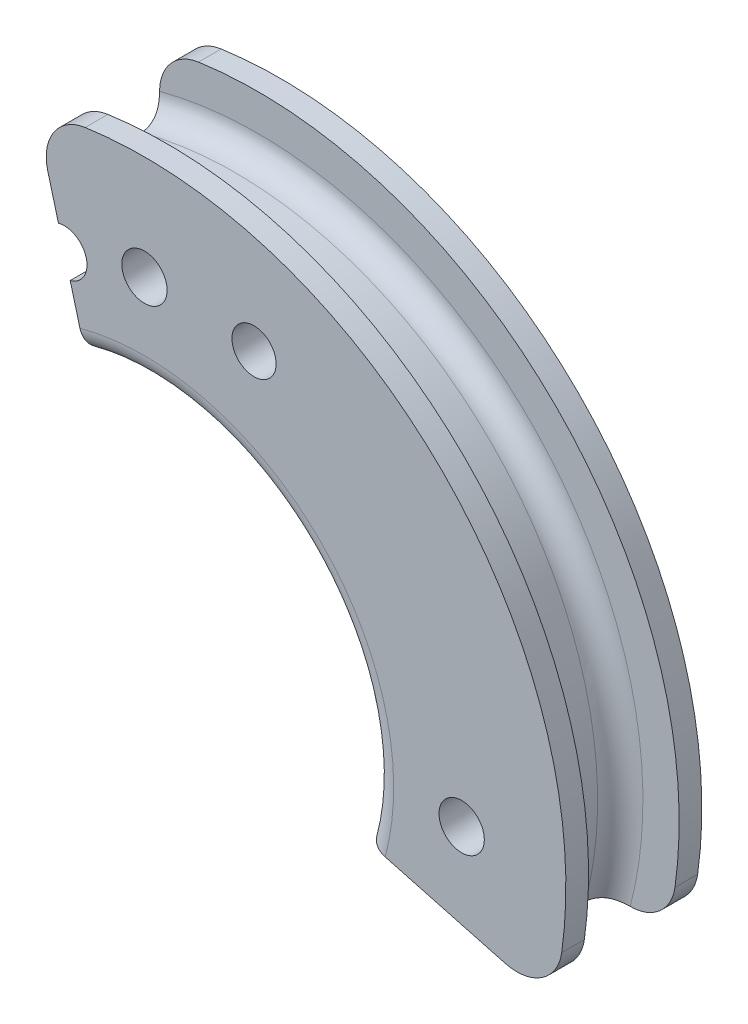
ISO-10303-21;
HEADER;
FILE_DESCRIPTION(('STEP AP214'),'2;1');
FILE_NAME('part.step','',(''),(''),'','','');
FILE_SCHEMA(('AUTOMOTIVE_DESIGN { 1 0 10303 214 1 1 1 1 }'));
ENDSEC;
DATA;
#1=APPLICATION_CONTEXT('core data for automotive mechanical design processes');
#2=APPLICATION_PROTOCOL_DEFINITION('international standard','automotive_design',2000,#1);
#3=PRODUCT_CONTEXT('',#1,'mechanical');
#4=PRODUCT('Part','Part','',(#3));
#5=PRODUCT_RELATED_PRODUCT_CATEGORY('part','',(#4));
#6=PRODUCT_DEFINITION_FORMATION('','',#4);
#7=PRODUCT_DEFINITION_CONTEXT('part definition',#1,'design');
#8=PRODUCT_DEFINITION('design','',#6,#7);
#9=PRODUCT_DEFINITION_SHAPE('','',#8);
#10=(LENGTH_UNIT() NAMED_UNIT(*) SI_UNIT(.MILLI.,.METRE.));
#11=(NAMED_UNIT(*) PLANE_ANGLE_UNIT() SI_UNIT($,.RADIAN.));
#12=(NAMED_UNIT(*) SI_UNIT($,.STERADIAN.) SOLID_ANGLE_UNIT());
#13=UNCERTAINTY_MEASURE_WITH_UNIT(LENGTH_MEASURE(1.E-05),#10,'distance_accuracy_value','');
#14=(GEOMETRIC_REPRESENTATION_CONTEXT(3) GLOBAL_UNCERTAINTY_ASSIGNED_CONTEXT((#13)) GLOBAL_UNIT_ASSIGNED_CONTEXT((#10,
#11,#12)) REPRESENTATION_CONTEXT('',''));
#15=CARTESIAN_POINT('',(0.,0.,0.));
#16=DIRECTION('',(0.,0.,1.));
#17=DIRECTION('',(1.,0.,0.));
#18=AXIS2_PLACEMENT_3D('',#15,#16,#17);
#19=CARTESIAN_POINT('',(-2.65426315247376,9.90584494169013,-1.5));
#20=DIRECTION('',(0.965925826289069,0.258819045102518,0.));
#21=DIRECTION('',(-0.258819045102518,0.965925826289069,0.));
#22=AXIS2_PLACEMENT_3D('',#19,#20,#21);
#23=PLANE('',#22);
#24=CARTESIAN_POINT('',(-2.1999618833714,8.21036952345709,-0.499999999999999));
#25=DIRECTION('',(0.965925826289069,0.258819045102518,0.));
#26=DIRECTION('',(-0.258819045102518,0.965925826289069,0.));
#27=AXIS2_PLACEMENT_3D('',#24,#25,#26);
#28=CIRCLE('',#27,0.500000000000001);
#29=CARTESIAN_POINT('',(-2.07055236082014,7.72740661031255,-0.499999999999999));
#30=VERTEX_POINT('',#29);
#31=CARTESIAN_POINT('',(-2.13254957000702,7.95878334492546,-0.926802032303871));
#32=VERTEX_POINT('',#31);
#33=EDGE_CURVE('E198',#30,#32,#28,.T.);
#34=ORIENTED_EDGE('',*,*,#33,.T.);
#35=DIRECTION('',(0.,0.,-1.));
#36=VECTOR('',#35,1.);
#37=CARTESIAN_POINT('',(-2.13254957000702,7.95878334492546,-1.5));
#38=LINE('',#37,#36);
#39=CARTESIAN_POINT('',(-2.13254957000702,7.95878334492546,-1.5));
#40=VERTEX_POINT('',#39);
#41=EDGE_CURVE('E187',#32,#40,#38,.T.);
#42=ORIENTED_EDGE('',*,*,#41,.T.);
#43=DIRECTION('',(-0.258819045102518,0.965925826289069,0.));
#44=VECTOR('',#43,1.);
#45=CARTESIAN_POINT('',(-2.65426315247376,9.90584494169013,-1.5));
#46=LINE('',#45,#44);
#47=CARTESIAN_POINT('',(-1.89766269349181,7.08217358773951,-1.5));
#48=VERTEX_POINT('',#47);
#49=EDGE_CURVE('E180',#48,#40,#46,.T.);
#50=ORIENTED_EDGE('',*,*,#49,.F.);
#51=DIRECTION('',(0.,0.,1.));
#52=VECTOR('',#51,1.);
#53=CARTESIAN_POINT('',(-1.89766269349181,7.08217358773951,-1.5));
#54=LINE('',#53,#52);
#55=CARTESIAN_POINT('',(-1.89766269349181,7.08217358773951,1.5));
#56=VERTEX_POINT('',#55);
#57=EDGE_CURVE('E160',#48,#56,#54,.T.);
#58=ORIENTED_EDGE('',*,*,#57,.T.);
#59=DIRECTION('',(-0.258819045102518,0.965925826289069,0.));
#60=VECTOR('',#59,1.);
#61=CARTESIAN_POINT('',(-2.65426315247376,9.90584494169013,1.5));
#62=LINE('',#61,#60);
#63=CARTESIAN_POINT('',(-2.13254957000702,7.95878334492546,1.5));
#64=VERTEX_POINT('',#63);
#65=EDGE_CURVE('E377',#56,#64,#62,.T.);
#66=ORIENTED_EDGE('',*,*,#65,.T.);
#67=DIRECTION('',(0.,0.,-1.));
#68=VECTOR('',#67,1.);
#69=CARTESIAN_POINT('',(-2.13254957000702,7.95878334492546,1.));
#70=LINE('',#69,#68);
#71=CARTESIAN_POINT('',(-2.13254957000702,7.95878334492546,0.926802032303871));
#72=VERTEX_POINT('',#71);
#73=EDGE_CURVE('E442',#64,#72,#70,.T.);
#74=ORIENTED_EDGE('',*,*,#73,.T.);
#75=CARTESIAN_POINT('',(-2.1999618833714,8.21036952345709,0.5));
#76=DIRECTION('',(0.965925826289069,0.258819045102518,0.));
#77=DIRECTION('',(-0.258819045102518,0.965925826289069,0.));
#78=AXIS2_PLACEMENT_3D('',#75,#76,#77);
#79=CIRCLE('',#78,0.5);
#80=CARTESIAN_POINT('',(-2.07055236082014,7.72740661031255,0.499999999999999));
#81=VERTEX_POINT('',#80);
#82=EDGE_CURVE('E190',#72,#81,#79,.T.);
#83=ORIENTED_EDGE('',*,*,#82,.T.);
#84=DIRECTION('',(0.,0.,1.));
#85=VECTOR('',#84,1.);
#86=CARTESIAN_POINT('',(-2.07055236082014,7.72740661031255,0.));
#87=LINE('',#86,#85);
#88=EDGE_CURVE('E196',#81,#30,#87,.F.);
#89=ORIENTED_EDGE('',*,*,#88,.T.);
#90=EDGE_LOOP('',(#34,#42,#50,#58,#66,#74,#83,#89));
#91=FACE_BOUND('',#90,.T.);
#92=ADVANCED_FACE('F32',(#91),#23,.F.);
#93=CARTESIAN_POINT('',(0.,0.,1.5));
#94=DIRECTION('',(0.,0.,1.));
#95=DIRECTION('',(1.,0.,0.));
#96=AXIS2_PLACEMENT_3D('',#93,#94,#95);
#97=PLANE('',#96);
#98=DIRECTION('',(-0.965925826289066,0.258819045102528,0.));
#99=VECTOR('',#98,1.);
#100=CARTESIAN_POINT('',(10.3501453744562,-2.77331309463034,1.5));
#101=LINE('',#100,#99);
#102=CARTESIAN_POINT('',(7.95878334492544,-2.1325495700071,1.5));
#103=VERTEX_POINT('',#102);
#104=CARTESIAN_POINT('',(5.31259204458986,-1.4235047480639,1.5));
#105=VERTEX_POINT('',#104);
#106=EDGE_CURVE('E376',#103,#105,#101,.T.);
#107=ORIENTED_EDGE('',*,*,#106,.F.);
#108=CARTESIAN_POINT('',(8.21760239002796,-1.16662374371804,1.5));
#109=DIRECTION('',(0.,0.,1.));
#110=DIRECTION('',(1.,0.,0.));
#111=AXIS2_PLACEMENT_3D('',#108,#109,#110);
#112=CIRCLE('',#111,1.);
#113=CARTESIAN_POINT('',(9.20767496713977,-1.30718082127443,1.5));
#114=VERTEX_POINT('',#113);
#115=EDGE_CURVE('E424',#103,#114,#112,.T.);
#116=ORIENTED_EDGE('',*,*,#115,.T.);
#117=CARTESIAN_POINT('',(0.,0.,1.5));
#118=DIRECTION('',(0.,0.,1.));
#119=DIRECTION('',(1.,0.,0.));
#120=AXIS2_PLACEMENT_3D('',#117,#118,#119);
#121=CIRCLE('',#120,9.3);
#122=CARTESIAN_POINT('',(-1.30718082127433,9.20767496713978,1.5));
#123=VERTEX_POINT('',#122);
#124=EDGE_CURVE('E216',#114,#123,#121,.T.);
#125=ORIENTED_EDGE('',*,*,#124,.T.);
#126=CARTESIAN_POINT('',(-1.16662374371795,8.21760239002798,1.5));
#127=DIRECTION('',(0.,0.,1.));
#128=DIRECTION('',(1.,0.,0.));
#129=AXIS2_PLACEMENT_3D('',#126,#127,#128);
#130=CIRCLE('',#129,1.);
#131=EDGE_CURVE('E421',#123,#64,#130,.T.);
#132=ORIENTED_EDGE('',*,*,#131,.T.);
#133=ORIENTED_EDGE('',*,*,#65,.F.);
#134=CARTESIAN_POINT('',(-1.76825317094055,6.59921067459497,1.5));
#135=DIRECTION('',(0.,0.,1.));
#136=DIRECTION('',(1.,0.,0.));
#137=AXIS2_PLACEMENT_3D('',#134,#135,#136);
#138=CIRCLE('',#137,0.500000000000001);
#139=CARTESIAN_POINT('',(-1.63884364838929,6.11624776145044,1.5));
#140=VERTEX_POINT('',#139);
#141=EDGE_CURVE('E167',#140,#56,#138,.T.);
#142=ORIENTED_EDGE('',*,*,#141,.F.);
#143=CARTESIAN_POINT('',(-1.42350474806385,5.31259204458988,1.5));
#144=VERTEX_POINT('',#143);
#145=EDGE_CURVE('E191',#144,#140,#62,.T.);
#146=ORIENTED_EDGE('',*,*,#145,.F.);
#147=CARTESIAN_POINT('',(0.,0.,1.5));
#148=DIRECTION('',(0.,0.,1.));
#149=DIRECTION('',(1.,0.,0.));
#150=AXIS2_PLACEMENT_3D('',#147,#148,#149);
#151=CIRCLE('',#150,5.5);
#152=EDGE_CURVE('E255',#144,#105,#151,.F.);
#153=ORIENTED_EDGE('',*,*,#152,.T.);
#154=EDGE_LOOP('',(#107,#116,#125,#132,#133,#142,#146,#153));
#155=FACE_BOUND('',#154,.T.);
#156=CARTESIAN_POINT('',(2.41801105724694,6.7945993770836,1.5));
#157=DIRECTION('',(0.,0.,1.));
#158=DIRECTION('',(1.,0.,0.));
#159=AXIS2_PLACEMENT_3D('',#156,#157,#158);
#160=CIRCLE('',#159,0.487297939704498);
#161=CARTESIAN_POINT('',(2.90530899695144,6.7945993770836,1.5));
#162=VERTEX_POINT('',#161);
#163=EDGE_CURVE('E380',#162,#162,#160,.T.);
#164=ORIENTED_EDGE('',*,*,#163,.F.);
#165=EDGE_LOOP('',(#164));
#166=FACE_BOUND('',#165,.T.);
#167=CARTESIAN_POINT('',(7.,0.,1.5));
#168=DIRECTION('',(0.,0.,1.));
#169=DIRECTION('',(1.,0.,0.));
#170=AXIS2_PLACEMENT_3D('',#167,#168,#169);
#171=CIRCLE('',#170,0.499999999999999);
#172=CARTESIAN_POINT('',(7.5,0.,1.5));
#173=VERTEX_POINT('',#172);
#174=EDGE_CURVE('E241',#173,#173,#171,.T.);
#175=ORIENTED_EDGE('',*,*,#174,.F.);
#176=EDGE_LOOP('',(#175));
#177=FACE_BOUND('',#176,.T.);
#178=CARTESIAN_POINT('',(0.,7.,1.5));
#179=DIRECTION('',(0.,0.,1.));
#180=DIRECTION('',(1.,0.,0.));
#181=AXIS2_PLACEMENT_3D('',#178,#179,#180);
#182=CIRCLE('',#181,0.500000000000001);
#183=CARTESIAN_POINT('',(0.500000000000002,7.,1.5));
#184=VERTEX_POINT('',#183);
#185=EDGE_CURVE('E238',#184,#184,#182,.T.);
#186=ORIENTED_EDGE('',*,*,#185,.F.);
#187=EDGE_LOOP('',(#186));
#188=FACE_BOUND('',#187,.T.);
#189=ADVANCED_FACE('F333',(#155,#166,#177,#188),#97,.T.);
#190=CARTESIAN_POINT('',(0.,0.,-1.5));
#191=DIRECTION('',(0.,0.,1.));
#192=DIRECTION('',(1.,0.,0.));
#193=AXIS2_PLACEMENT_3D('',#190,#191,#192);
#194=PLANE('',#193);
#195=CARTESIAN_POINT('',(2.41801105724694,6.7945993770836,-1.5));
#196=DIRECTION('',(0.,0.,1.));
#197=DIRECTION('',(1.,0.,0.));
#198=AXIS2_PLACEMENT_3D('',#195,#196,#197);
#199=CIRCLE('',#198,1.4872979397045);
#200=CARTESIAN_POINT('',(0.930713117542441,6.7945993770836,-1.5));
#201=VERTEX_POINT('',#200);
#202=EDGE_CURVE('E443',#201,#201,#199,.T.);
#203=ORIENTED_EDGE('',*,*,#202,.T.);
#204=EDGE_LOOP('',(#203));
#205=FACE_BOUND('',#204,.T.);
#206=CARTESIAN_POINT('',(0.,0.,-1.5));
#207=DIRECTION('',(0.,0.,1.));
#208=DIRECTION('',(1.,0.,0.));
#209=AXIS2_PLACEMENT_3D('',#206,#207,#208);
#210=CIRCLE('',#209,5.5);
#211=CARTESIAN_POINT('',(5.31259204458986,-1.4235047480639,-1.5));
#212=VERTEX_POINT('',#211);
#213=CARTESIAN_POINT('',(5.5,0.,-1.5));
#214=VERTEX_POINT('',#213);
#215=EDGE_CURVE('E264',#212,#214,#210,.T.);
#216=ORIENTED_EDGE('',*,*,#215,.T.);
#217=CARTESIAN_POINT('',(7.,0.,-1.5));
#218=DIRECTION('',(0.,0.,1.));
#219=DIRECTION('',(1.,0.,0.));
#220=AXIS2_PLACEMENT_3D('',#217,#218,#219);
#221=CIRCLE('',#220,1.5);
#222=EDGE_CURVE('E45',#214,#214,#221,.T.);
#223=ORIENTED_EDGE('',*,*,#222,.T.);
#224=CARTESIAN_POINT('',(-1.42350474806385,5.31259204458988,-1.5));
#225=VERTEX_POINT('',#224);
#226=EDGE_CURVE('E263',#214,#225,#210,.T.);
#227=ORIENTED_EDGE('',*,*,#226,.T.);
#228=CARTESIAN_POINT('',(-1.63884364838929,6.11624776145044,-1.5));
#229=VERTEX_POINT('',#228);
#230=EDGE_CURVE('E182',#225,#229,#46,.T.);
#231=ORIENTED_EDGE('',*,*,#230,.T.);
#232=CARTESIAN_POINT('',(-1.76825317094055,6.59921067459497,-1.5));
#233=DIRECTION('',(0.,0.,1.));
#234=DIRECTION('',(1.,0.,0.));
#235=AXIS2_PLACEMENT_3D('',#232,#233,#234);
#236=CIRCLE('',#235,0.500000000000001);
#237=EDGE_CURVE('E164',#229,#48,#236,.T.);
#238=ORIENTED_EDGE('',*,*,#237,.T.);
#239=ORIENTED_EDGE('',*,*,#49,.T.);
#240=CARTESIAN_POINT('',(-1.16662374371795,8.21760239002798,-1.5));
#241=DIRECTION('',(0.,0.,1.));
#242=DIRECTION('',(1.,0.,0.));
#243=AXIS2_PLACEMENT_3D('',#240,#241,#242);
#244=CIRCLE('',#243,1.);
#245=CARTESIAN_POINT('',(-1.30718082127433,9.20767496713978,-1.5));
#246=VERTEX_POINT('',#245);
#247=EDGE_CURVE('E422',#40,#246,#244,.F.);
#248=ORIENTED_EDGE('',*,*,#247,.T.);
#249=CARTESIAN_POINT('',(0.,0.,-1.5));
#250=DIRECTION('',(0.,0.,1.));
#251=DIRECTION('',(1.,0.,0.));
#252=AXIS2_PLACEMENT_3D('',#249,#250,#251);
#253=CIRCLE('',#252,9.3);
#254=CARTESIAN_POINT('',(9.20767496713977,-1.30718082127443,-1.5));
#255=VERTEX_POINT('',#254);
#256=EDGE_CURVE('E219',#255,#246,#253,.T.);
#257=ORIENTED_EDGE('',*,*,#256,.F.);
#258=CARTESIAN_POINT('',(8.21760239002796,-1.16662374371804,-1.5));
#259=DIRECTION('',(0.,0.,1.));
#260=DIRECTION('',(1.,0.,0.));
#261=AXIS2_PLACEMENT_3D('',#258,#259,#260);
#262=CIRCLE('',#261,1.);
#263=CARTESIAN_POINT('',(7.95878334492544,-2.1325495700071,-1.5));
#264=VERTEX_POINT('',#263);
#265=EDGE_CURVE('E417',#255,#264,#262,.F.);
#266=ORIENTED_EDGE('',*,*,#265,.T.);
#267=DIRECTION('',(-0.965925826289066,0.258819045102528,0.));
#268=VECTOR('',#267,1.);
#269=CARTESIAN_POINT('',(10.3501453744562,-2.77331309463034,-1.5));
#270=LINE('',#269,#268);
#271=EDGE_CURVE('E188',#264,#212,#270,.T.);
#272=ORIENTED_EDGE('',*,*,#271,.T.);
#273=EDGE_LOOP('',(#216,#223,#227,#231,#238,#239,#248,#257,#266,#272));
#274=FACE_BOUND('',#273,.T.);
#275=CARTESIAN_POINT('',(0.,7.,-1.5));
#276=DIRECTION('',(0.,0.,1.));
#277=DIRECTION('',(1.,0.,0.));
#278=AXIS2_PLACEMENT_3D('',#275,#276,#277);
#279=CIRCLE('',#278,0.500000000000001);
#280=CARTESIAN_POINT('',(0.500000000000002,7.,-1.5));
#281=VERTEX_POINT('',#280);
#282=EDGE_CURVE('E237',#281,#281,#279,.T.);
#283=ORIENTED_EDGE('',*,*,#282,.T.);
#284=EDGE_LOOP('',(#283));
#285=FACE_BOUND('',#284,.T.);
#286=ADVANCED_FACE('F178',(#205,#274,#285),#194,.F.);
#287=CARTESIAN_POINT('',(0.,0.,1.5));
#288=DIRECTION('',(0.,0.,-1.));
#289=DIRECTION('',(-1.,0.,0.));
#290=AXIS2_PLACEMENT_3D('',#287,#288,#289);
#291=CYLINDRICAL_SURFACE('',#290,5.);
#292=DIRECTION('',(0.,0.,-1.));
#293=VECTOR('',#292,1.);
#294=CARTESIAN_POINT('',(4.82962913144533,-1.29409522551264,1.5));
#295=LINE('',#294,#293);
#296=CARTESIAN_POINT('',(4.82962913144533,-1.29409522551264,1.));
#297=VERTEX_POINT('',#296);
#298=CARTESIAN_POINT('',(4.82962913144533,-1.29409522551264,-1.));
#299=VERTEX_POINT('',#298);
#300=EDGE_CURVE('E210',#297,#299,#295,.T.);
#301=ORIENTED_EDGE('',*,*,#300,.F.);
#302=CARTESIAN_POINT('',(0.,0.,1.));
#303=DIRECTION('',(0.,0.,1.));
#304=DIRECTION('',(1.,0.,0.));
#305=AXIS2_PLACEMENT_3D('',#302,#303,#304);
#306=CIRCLE('',#305,5.);
#307=CARTESIAN_POINT('',(-1.29409522551259,4.82962913144534,1.));
#308=VERTEX_POINT('',#307);
#309=EDGE_CURVE('E248',#297,#308,#306,.T.);
#310=ORIENTED_EDGE('',*,*,#309,.T.);
#311=DIRECTION('',(0.,0.,-1.));
#312=VECTOR('',#311,1.);
#313=CARTESIAN_POINT('',(-1.29409522551259,4.82962913144534,1.5));
#314=LINE('',#313,#312);
#315=CARTESIAN_POINT('',(-1.29409522551259,4.82962913144534,-1.));
#316=VERTEX_POINT('',#315);
#317=EDGE_CURVE('E200',#316,#308,#314,.F.);
#318=ORIENTED_EDGE('',*,*,#317,.F.);
#319=CARTESIAN_POINT('',(0.,0.,-1.));
#320=DIRECTION('',(0.,0.,1.));
#321=DIRECTION('',(1.,0.,0.));
#322=AXIS2_PLACEMENT_3D('',#319,#320,#321);
#323=CIRCLE('',#322,5.);
#324=EDGE_CURVE('E172',#316,#299,#323,.F.);
#325=ORIENTED_EDGE('',*,*,#324,.T.);
#326=EDGE_LOOP('',(#301,#310,#318,#325));
#327=FACE_BOUND('',#326,.T.);
#328=ADVANCED_FACE('F361',(#327),#291,.F.);
#329=CARTESIAN_POINT('',(7.,0.,1.5));
#330=DIRECTION('',(0.,0.,-1.));
#331=DIRECTION('',(-1.,0.,0.));
#332=AXIS2_PLACEMENT_3D('',#329,#330,#331);
#333=CYLINDRICAL_SURFACE('',#332,0.499999999999999);
#334=CARTESIAN_POINT('',(7.,0.,-0.499999999999996));
#335=DIRECTION('',(0.,0.,1.));
#336=DIRECTION('',(1.,0.,0.));
#337=AXIS2_PLACEMENT_3D('',#334,#335,#336);
#338=CIRCLE('',#337,0.499999999999999);
#339=CARTESIAN_POINT('',(7.5,0.,-0.499999999999996));
#340=VERTEX_POINT('',#339);
#341=EDGE_CURVE('E40',#340,#340,#338,.F.);
#342=ORIENTED_EDGE('',*,*,#341,.T.);
#343=EDGE_LOOP('',(#342));
#344=FACE_BOUND('',#343,.T.);
#345=ORIENTED_EDGE('',*,*,#174,.T.);
#346=EDGE_LOOP('',(#345));
#347=FACE_BOUND('',#346,.T.);
#348=ADVANCED_FACE('F393',(#344,#347),#333,.F.);
#349=CARTESIAN_POINT('',(0.,7.,1.5));
#350=DIRECTION('',(0.,0.,-1.));
#351=DIRECTION('',(-1.,0.,0.));
#352=AXIS2_PLACEMENT_3D('',#349,#350,#351);
#353=CYLINDRICAL_SURFACE('',#352,0.500000000000001);
#354=ORIENTED_EDGE('',*,*,#185,.T.);
#355=EDGE_LOOP('',(#354));
#356=FACE_BOUND('',#355,.T.);
#357=ORIENTED_EDGE('',*,*,#282,.F.);
#358=EDGE_LOOP('',(#357));
#359=FACE_BOUND('',#358,.T.);
#360=ADVANCED_FACE('F329',(#356,#359),#353,.F.);
#361=CARTESIAN_POINT('',(0.,0.,-0.499999999999999));
#362=DIRECTION('',(0.,0.,1.));
#363=DIRECTION('',(1.,0.,0.));
#364=AXIS2_PLACEMENT_3D('',#361,#362,#363);
#365=TOROIDAL_SURFACE('',#364,8.5,0.500000000000001);
#366=CARTESIAN_POINT('',(8.21036952345707,-2.19996188337149,-0.499999999999999));
#367=DIRECTION('',(0.258819045102528,0.965925826289066,0.));
#368=DIRECTION('',(-0.965925826289067,0.258819045102528,0.));
#369=AXIS2_PLACEMENT_3D('',#366,#367,#368);
#370=CIRCLE('',#369,0.500000000000001);
#371=CARTESIAN_POINT('',(7.95878334492544,-2.1325495700071,-0.92680203230387));
#372=VERTEX_POINT('',#371);
#373=CARTESIAN_POINT('',(7.72740661031253,-2.07055236082022,-0.499999999999999));
#374=VERTEX_POINT('',#373);
#375=EDGE_CURVE('E208',#372,#374,#370,.T.);
#376=ORIENTED_EDGE('',*,*,#375,.F.);
#377=CARTESIAN_POINT('',(7.95878334492544,-2.1325495700071,-0.92680203230387));
#378=CARTESIAN_POINT('',(7.98032312676728,-2.1383521577099,-0.940458247360537));
#379=CARTESIAN_POINT('',(8.00315172706614,-2.14366644102367,-0.952309263321304));
#380=CARTESIAN_POINT('',(8.05008081458118,-2.15276681468098,-0.971949154373012));
#381=CARTESIAN_POINT('',(8.07413510467996,-2.15658785745952,-0.979832365841142));
#382=CARTESIAN_POINT('',(8.11816081402254,-2.16186027066998,-0.990524061954298));
#383=CARTESIAN_POINT('',(8.13792128141101,-2.16364171413765,-0.994052781450043));
#384=CARTESIAN_POINT('',(8.17819400886892,-2.16605713893131,-0.998819381859687));
#385=CARTESIAN_POINT('',(8.19871339056958,-2.16666717532724,-1.00000946956246));
#386=CARTESIAN_POINT('',(8.21923033471833,-2.1666224186152,-1.));
#387=B_SPLINE_CURVE_WITH_KNOTS('',3,(#377,#378,#379,#380,#381,#382,#383,#384,#385,#386),
.UNSPECIFIED.,.F.,.F.,(4,2,2,2,4),(0.,0.0783956304048873,0.154827082050498,0.215112414137625,
0.276617452457446),.UNSPECIFIED.);
#388=CARTESIAN_POINT('',(8.21923033471833,-2.16662241861519,-1.));
#389=VERTEX_POINT('',#388);
#390=EDGE_CURVE('E279',#372,#389,#387,.T.);
#391=ORIENTED_EDGE('',*,*,#390,.T.);
#392=CARTESIAN_POINT('',(0.,0.,-1.));
#393=DIRECTION('',(0.,0.,1.));
#394=DIRECTION('',(1.,0.,0.));
#395=AXIS2_PLACEMENT_3D('',#392,#393,#394);
#396=CIRCLE('',#395,8.5);
#397=CARTESIAN_POINT('',(-2.16662241861512,8.21923033471835,-1.));
#398=VERTEX_POINT('',#397);
#399=EDGE_CURVE('E225',#389,#398,#396,.T.);
#400=ORIENTED_EDGE('',*,*,#399,.T.);
#401=CARTESIAN_POINT('',(-2.16662241861512,8.21923033471835,-1.));
#402=CARTESIAN_POINT('',(-2.16670178233861,8.19307503880606,-1.00003724409534));
#403=CARTESIAN_POINT('',(-2.16568233287674,8.16690361720526,-0.998084843299811));
#404=CARTESIAN_POINT('',(-2.16175537254433,8.11596352609852,-0.990311504084287));
#405=CARTESIAN_POINT('',(-2.15889577707815,8.09117614124369,-0.984588656266716));
#406=CARTESIAN_POINT('',(-2.15234841258296,8.04813446073007,-0.970989152095519));
#407=CARTESIAN_POINT('',(-2.14896313895612,8.02960609001122,-0.963822721265301));
#408=CARTESIAN_POINT('',(-2.14134102498127,7.9933737424651,-0.947100013858474));
#409=CARTESIAN_POINT('',(-2.13708834014832,7.97569403191458,-0.93749831558258));
#410=CARTESIAN_POINT('',(-2.13254957000702,7.95878334492546,-0.92680203230387));
#411=B_SPLINE_CURVE_WITH_KNOTS('',3,(#401,#402,#403,#404,#405,#406,#407,#408,#409,#410),
.UNSPECIFIED.,.F.,.F.,(4,2,2,2,4),(0.,0.0783932173873378,0.154823502964689,0.215110524856777,
0.276617382951252),.UNSPECIFIED.);
#412=EDGE_CURVE('E272',#398,#32,#411,.T.);
#413=ORIENTED_EDGE('',*,*,#412,.T.);
#414=ORIENTED_EDGE('',*,*,#33,.F.);
#415=CARTESIAN_POINT('',(0.,0.,-0.499999999999999));
#416=DIRECTION('',(0.,0.,1.));
#417=DIRECTION('',(1.,0.,0.));
#418=AXIS2_PLACEMENT_3D('',#415,#416,#417);
#419=CIRCLE('',#418,8.);
#420=EDGE_CURVE('E234',#374,#30,#419,.T.);
#421=ORIENTED_EDGE('',*,*,#420,.F.);
#422=EDGE_LOOP('',(#376,#391,#400,#413,#414,#421));
#423=FACE_BOUND('',#422,.T.);
#424=ADVANCED_FACE('F285',(#423),#365,.F.);
#425=CARTESIAN_POINT('',(0.,0.,0.));
#426=DIRECTION('',(0.,0.,1.));
#427=DIRECTION('',(1.,0.,0.));
#428=AXIS2_PLACEMENT_3D('',#425,#426,#427);
#429=CYLINDRICAL_SURFACE('',#428,8.);
#430=DIRECTION('',(0.,0.,1.));
#431=VECTOR('',#430,1.);
#432=CARTESIAN_POINT('',(7.72740661031253,-2.07055236082022,0.));
#433=LINE('',#432,#431);
#434=CARTESIAN_POINT('',(7.72740661031253,-2.07055236082022,0.499999999999999));
#435=VERTEX_POINT('',#434);
#436=EDGE_CURVE('E206',#374,#435,#433,.T.);
#437=ORIENTED_EDGE('',*,*,#436,.F.);
#438=ORIENTED_EDGE('',*,*,#420,.T.);
#439=ORIENTED_EDGE('',*,*,#88,.F.);
#440=CARTESIAN_POINT('',(0.,0.,0.499999999999999));
#441=DIRECTION('',(0.,0.,1.));
#442=DIRECTION('',(1.,0.,0.));
#443=AXIS2_PLACEMENT_3D('',#440,#441,#442);
#444=CIRCLE('',#443,8.);
#445=EDGE_CURVE('E231',#435,#81,#444,.T.);
#446=ORIENTED_EDGE('',*,*,#445,.F.);
#447=EDGE_LOOP('',(#437,#438,#439,#446));
#448=FACE_BOUND('',#447,.T.);
#449=ADVANCED_FACE('F320',(#448),#429,.T.);
#450=CARTESIAN_POINT('',(0.,0.,0.5));
#451=DIRECTION('',(0.,0.,1.));
#452=DIRECTION('',(1.,0.,0.));
#453=AXIS2_PLACEMENT_3D('',#450,#451,#452);
#454=TOROIDAL_SURFACE('',#453,8.5,0.5);
#455=CARTESIAN_POINT('',(0.,0.,1.));
#456=DIRECTION('',(0.,0.,1.));
#457=DIRECTION('',(1.,0.,0.));
#458=AXIS2_PLACEMENT_3D('',#455,#456,#457);
#459=CIRCLE('',#458,8.5);
#460=CARTESIAN_POINT('',(8.21923033471833,-2.1666224186152,1.));
#461=VERTEX_POINT('',#460);
#462=CARTESIAN_POINT('',(-2.16662241861511,8.21923033471836,1.));
#463=VERTEX_POINT('',#462);
#464=EDGE_CURVE('E228',#461,#463,#459,.T.);
#465=ORIENTED_EDGE('',*,*,#464,.F.);
#466=CARTESIAN_POINT('',(8.21923033471833,-2.1666224186152,1.));
#467=CARTESIAN_POINT('',(8.19307503880604,-2.1667017823387,1.00003724409534));
#468=CARTESIAN_POINT('',(8.16690361720524,-2.16568233287683,0.99808484329981));
#469=CARTESIAN_POINT('',(8.11596352609849,-2.16175537254441,0.990311504084287));
#470=CARTESIAN_POINT('',(8.09117614124367,-2.15889577707823,0.984588656266716));
#471=CARTESIAN_POINT('',(8.04813446073005,-2.15234841258304,0.970989152095519));
#472=CARTESIAN_POINT('',(8.02960609001119,-2.1489631389562,0.9638227212653));
#473=CARTESIAN_POINT('',(7.99337374246508,-2.14134102498135,0.947100013858472));
#474=CARTESIAN_POINT('',(7.97569403191455,-2.1370883401484,0.937498315582579));
#475=CARTESIAN_POINT('',(7.95878334492544,-2.1325495700071,0.926802032303869));
#476=B_SPLINE_CURVE_WITH_KNOTS('',3,(#466,#467,#468,#469,#470,#471,#472,#473,#474,#475),
.UNSPECIFIED.,.F.,.F.,(4,2,2,2,4),(0.,0.0783932173873378,0.154823502964689,0.215110524856779,
0.276617382951254),.UNSPECIFIED.);
#477=CARTESIAN_POINT('',(7.95878334492544,-2.1325495700071,0.92680203230387));
#478=VERTEX_POINT('',#477);
#479=EDGE_CURVE('E308',#461,#478,#476,.T.);
#480=ORIENTED_EDGE('',*,*,#479,.T.);
#481=CARTESIAN_POINT('',(8.21036952345707,-2.19996188337149,0.5));
#482=DIRECTION('',(0.258819045102528,0.965925826289066,0.));
#483=DIRECTION('',(-0.965925826289067,0.258819045102528,0.));
#484=AXIS2_PLACEMENT_3D('',#481,#482,#483);
#485=CIRCLE('',#484,0.5);
#486=EDGE_CURVE('E203',#435,#478,#485,.T.);
#487=ORIENTED_EDGE('',*,*,#486,.F.);
#488=ORIENTED_EDGE('',*,*,#445,.T.);
#489=ORIENTED_EDGE('',*,*,#82,.F.);
#490=CARTESIAN_POINT('',(-2.13254957000702,7.95878334492546,0.926802032303871));
#491=CARTESIAN_POINT('',(-2.13835215770982,7.9803231267673,0.940458247360537));
#492=CARTESIAN_POINT('',(-2.14366644102359,8.00315172706616,0.952309263321304));
#493=CARTESIAN_POINT('',(-2.1527668146809,8.05008081458121,0.971949154373012));
#494=CARTESIAN_POINT('',(-2.15658785745944,8.07413510467998,0.979832365841142));
#495=CARTESIAN_POINT('',(-2.1618602706699,8.11816081402256,0.990524061954299));
#496=CARTESIAN_POINT('',(-2.16364171413756,8.13792128141103,0.994052781450043));
#497=CARTESIAN_POINT('',(-2.16605713893123,8.17819400886894,0.998819381859687));
#498=CARTESIAN_POINT('',(-2.16666717532716,8.1987133905696,1.00000946956246));
#499=CARTESIAN_POINT('',(-2.16662241861512,8.21923033471836,1.));
#500=B_SPLINE_CURVE_WITH_KNOTS('',3,(#490,#491,#492,#493,#494,#495,#496,#497,#498,#499),
.UNSPECIFIED.,.F.,.F.,(4,2,2,2,4),(0.,0.0783956304048865,0.154827082050496,0.215112414137622,
0.276617452457447),.UNSPECIFIED.);
#501=EDGE_CURVE('E52',#72,#463,#500,.T.);
#502=ORIENTED_EDGE('',*,*,#501,.T.);
#503=EDGE_LOOP('',(#465,#480,#487,#488,#489,#502));
#504=FACE_BOUND('',#503,.T.);
#505=ADVANCED_FACE('F315',(#504),#454,.F.);
#506=CARTESIAN_POINT('',(8.5,0.,-1.));
#507=DIRECTION('',(0.,0.,1.));
#508=DIRECTION('',(1.,0.,0.));
#509=AXIS2_PLACEMENT_3D('',#506,#507,#508);
#510=PLANE('',#509);
#511=ORIENTED_EDGE('',*,*,#399,.F.);
#512=CARTESIAN_POINT('',(8.21760239002796,-1.16662374371804,-1.));
#513=DIRECTION('',(0.,0.,1.));
#514=DIRECTION('',(1.,0.,0.));
#515=AXIS2_PLACEMENT_3D('',#512,#513,#514);
#516=CIRCLE('',#515,1.);
#517=CARTESIAN_POINT('',(9.20767496713977,-1.30718082127443,-1.));
#518=VERTEX_POINT('',#517);
#519=EDGE_CURVE('E615',#389,#518,#516,.T.);
#520=ORIENTED_EDGE('',*,*,#519,.T.);
#521=CARTESIAN_POINT('',(0.,0.,-1.));
#522=DIRECTION('',(0.,0.,1.));
#523=DIRECTION('',(1.,0.,0.));
#524=AXIS2_PLACEMENT_3D('',#521,#522,#523);
#525=CIRCLE('',#524,9.3);
#526=CARTESIAN_POINT('',(-1.30718082127433,9.20767496713978,-1.));
#527=VERTEX_POINT('',#526);
#528=EDGE_CURVE('E222',#518,#527,#525,.T.);
#529=ORIENTED_EDGE('',*,*,#528,.T.);
#530=CARTESIAN_POINT('',(-1.16662374371795,8.21760239002798,-1.));
#531=DIRECTION('',(0.,0.,1.));
#532=DIRECTION('',(1.,0.,0.));
#533=AXIS2_PLACEMENT_3D('',#530,#531,#532);
#534=CIRCLE('',#533,1.);
#535=EDGE_CURVE('E612',#527,#398,#534,.T.);
#536=ORIENTED_EDGE('',*,*,#535,.T.);
#537=EDGE_LOOP('',(#511,#520,#529,#536));
#538=FACE_BOUND('',#537,.T.);
#539=ADVANCED_FACE('F319',(#538),#510,.T.);
#540=CARTESIAN_POINT('',(0.,0.,0.));
#541=DIRECTION('',(0.,0.,1.));
#542=DIRECTION('',(1.,0.,0.));
#543=AXIS2_PLACEMENT_3D('',#540,#541,#542);
#544=CYLINDRICAL_SURFACE('',#543,9.3);
#545=ORIENTED_EDGE('',*,*,#528,.F.);
#546=DIRECTION('',(0.,0.,1.));
#547=VECTOR('',#546,1.);
#548=CARTESIAN_POINT('',(9.20767496713977,-1.30718082127443,0.));
#549=LINE('',#548,#547);
#550=EDGE_CURVE('E419',#518,#255,#549,.F.);
#551=ORIENTED_EDGE('',*,*,#550,.T.);
#552=ORIENTED_EDGE('',*,*,#256,.T.);
#553=DIRECTION('',(0.,0.,1.));
#554=VECTOR('',#553,1.);
#555=CARTESIAN_POINT('',(-1.30718082127433,9.20767496713978,0.));
#556=LINE('',#555,#554);
#557=EDGE_CURVE('E613',#246,#527,#556,.T.);
#558=ORIENTED_EDGE('',*,*,#557,.T.);
#559=EDGE_LOOP('',(#545,#551,#552,#558));
#560=FACE_BOUND('',#559,.T.);
#561=ADVANCED_FACE('F575',(#560),#544,.T.);
#562=CARTESIAN_POINT('',(0.,0.,0.));
#563=DIRECTION('',(0.,0.,1.));
#564=DIRECTION('',(1.,0.,0.));
#565=AXIS2_PLACEMENT_3D('',#562,#563,#564);
#566=CYLINDRICAL_SURFACE('',#565,9.3);
#567=ORIENTED_EDGE('',*,*,#124,.F.);
#568=DIRECTION('',(0.,0.,1.));
#569=VECTOR('',#568,1.);
#570=CARTESIAN_POINT('',(9.20767496713977,-1.30718082127443,0.));
#571=LINE('',#570,#569);
#572=CARTESIAN_POINT('',(9.20767496713977,-1.30718082127443,1.));
#573=VERTEX_POINT('',#572);
#574=EDGE_CURVE('E432',#114,#573,#571,.F.);
#575=ORIENTED_EDGE('',*,*,#574,.T.);
#576=CARTESIAN_POINT('',(0.,0.,1.));
#577=DIRECTION('',(0.,0.,1.));
#578=DIRECTION('',(1.,0.,0.));
#579=AXIS2_PLACEMENT_3D('',#576,#577,#578);
#580=CIRCLE('',#579,9.3);
#581=CARTESIAN_POINT('',(-1.30718082127433,9.20767496713978,1.));
#582=VERTEX_POINT('',#581);
#583=EDGE_CURVE('E213',#573,#582,#580,.T.);
#584=ORIENTED_EDGE('',*,*,#583,.T.);
#585=DIRECTION('',(0.,0.,1.));
#586=VECTOR('',#585,1.);
#587=CARTESIAN_POINT('',(-1.30718082127433,9.20767496713978,0.));
#588=LINE('',#587,#586);
#589=EDGE_CURVE('E430',#582,#123,#588,.T.);
#590=ORIENTED_EDGE('',*,*,#589,.T.);
#591=EDGE_LOOP('',(#567,#575,#584,#590));
#592=FACE_BOUND('',#591,.T.);
#593=ADVANCED_FACE('F352',(#592),#566,.T.);
#594=CARTESIAN_POINT('',(8.5,0.,1.));
#595=DIRECTION('',(0.,0.,-1.));
#596=DIRECTION('',(-1.,0.,0.));
#597=AXIS2_PLACEMENT_3D('',#594,#595,#596);
#598=PLANE('',#597);
#599=ORIENTED_EDGE('',*,*,#583,.F.);
#600=CARTESIAN_POINT('',(8.21760239002796,-1.16662374371804,1.));
#601=DIRECTION('',(0.,0.,-1.));
#602=DIRECTION('',(-1.,0.,0.));
#603=AXIS2_PLACEMENT_3D('',#600,#601,#602);
#604=CIRCLE('',#603,1.);
#605=EDGE_CURVE('E309',#573,#461,#604,.T.);
#606=ORIENTED_EDGE('',*,*,#605,.T.);
#607=ORIENTED_EDGE('',*,*,#464,.T.);
#608=CARTESIAN_POINT('',(-1.16662374371795,8.21760239002798,1.));
#609=DIRECTION('',(0.,0.,-1.));
#610=DIRECTION('',(-1.,0.,0.));
#611=AXIS2_PLACEMENT_3D('',#608,#609,#610);
#612=CIRCLE('',#611,1.);
#613=EDGE_CURVE('E433',#463,#582,#612,.T.);
#614=ORIENTED_EDGE('',*,*,#613,.T.);
#615=EDGE_LOOP('',(#599,#606,#607,#614));
#616=FACE_BOUND('',#615,.T.);
#617=ADVANCED_FACE('F345',(#616),#598,.T.);
#618=ORIENTED_EDGE('',*,*,#317,.T.);
#619=CARTESIAN_POINT('',(-1.42350474806385,5.31259204458988,1.));
#620=DIRECTION('',(0.965925826289069,0.258819045102518,0.));
#621=DIRECTION('',(-0.258819045102518,0.965925826289069,0.));
#622=AXIS2_PLACEMENT_3D('',#619,#620,#621);
#623=CIRCLE('',#622,0.5);
#624=EDGE_CURVE('E253',#308,#144,#623,.F.);
#625=ORIENTED_EDGE('',*,*,#624,.T.);
#626=ORIENTED_EDGE('',*,*,#145,.T.);
#627=DIRECTION('',(0.,0.,1.));
#628=VECTOR('',#627,1.);
#629=CARTESIAN_POINT('',(-1.63884364838929,6.11624776145044,-1.5));
#630=LINE('',#629,#628);
#631=EDGE_CURVE('E173',#140,#229,#630,.F.);
#632=ORIENTED_EDGE('',*,*,#631,.T.);
#633=ORIENTED_EDGE('',*,*,#230,.F.);
#634=CARTESIAN_POINT('',(-1.42350474806385,5.31259204458988,-1.));
#635=DIRECTION('',(0.965925826289069,0.258819045102518,0.));
#636=DIRECTION('',(-0.258819045102518,0.965925826289069,0.));
#637=AXIS2_PLACEMENT_3D('',#634,#635,#636);
#638=CIRCLE('',#637,0.5);
#639=EDGE_CURVE('E251',#225,#316,#638,.F.);
#640=ORIENTED_EDGE('',*,*,#639,.T.);
#641=EDGE_LOOP('',(#618,#625,#626,#632,#633,#640));
#642=FACE_BOUND('',#641,.T.);
#643=ADVANCED_FACE('F335',(#642),#23,.F.);
#644=CARTESIAN_POINT('',(10.3501453744562,-2.77331309463034,-1.5));
#645=DIRECTION('',(0.258819045102528,0.965925826289066,0.));
#646=DIRECTION('',(-0.965925826289067,0.258819045102528,0.));
#647=AXIS2_PLACEMENT_3D('',#644,#645,#646);
#648=PLANE('',#647);
#649=ORIENTED_EDGE('',*,*,#271,.F.);
#650=DIRECTION('',(0.,0.,-1.));
#651=VECTOR('',#650,1.);
#652=CARTESIAN_POINT('',(7.95878334492544,-2.1325495700071,-1.));
#653=LINE('',#652,#651);
#654=EDGE_CURVE('E269',#264,#372,#653,.F.);
#655=ORIENTED_EDGE('',*,*,#654,.T.);
#656=ORIENTED_EDGE('',*,*,#375,.T.);
#657=ORIENTED_EDGE('',*,*,#436,.T.);
#658=ORIENTED_EDGE('',*,*,#486,.T.);
#659=DIRECTION('',(0.,0.,-1.));
#660=VECTOR('',#659,1.);
#661=CARTESIAN_POINT('',(7.95878334492544,-2.1325495700071,1.5));
#662=LINE('',#661,#660);
#663=EDGE_CURVE('E266',#478,#103,#662,.F.);
#664=ORIENTED_EDGE('',*,*,#663,.T.);
#665=ORIENTED_EDGE('',*,*,#106,.T.);
#666=CARTESIAN_POINT('',(5.31259204458987,-1.4235047480639,1.));
#667=DIRECTION('',(0.258819045102528,0.965925826289066,0.));
#668=DIRECTION('',(-0.965925826289067,0.258819045102528,0.));
#669=AXIS2_PLACEMENT_3D('',#666,#667,#668);
#670=CIRCLE('',#669,0.5);
#671=EDGE_CURVE('E261',#105,#297,#670,.F.);
#672=ORIENTED_EDGE('',*,*,#671,.T.);
#673=ORIENTED_EDGE('',*,*,#300,.T.);
#674=CARTESIAN_POINT('',(5.31259204458987,-1.4235047480639,-1.));
#675=DIRECTION('',(0.258819045102528,0.965925826289066,0.));
#676=DIRECTION('',(-0.965925826289067,0.258819045102528,0.));
#677=AXIS2_PLACEMENT_3D('',#674,#675,#676);
#678=CIRCLE('',#677,0.5);
#679=EDGE_CURVE('E258',#299,#212,#678,.F.);
#680=ORIENTED_EDGE('',*,*,#679,.T.);
#681=EDGE_LOOP('',(#649,#655,#656,#657,#658,#664,#665,#672,#673,#680));
#682=FACE_BOUND('',#681,.T.);
#683=ADVANCED_FACE('F344',(#682),#648,.F.);
#684=CARTESIAN_POINT('',(-1.76825317094055,6.59921067459497,-1.5));
#685=DIRECTION('',(0.,0.,1.));
#686=DIRECTION('',(1.,0.,0.));
#687=AXIS2_PLACEMENT_3D('',#684,#685,#686);
#688=CYLINDRICAL_SURFACE('',#687,0.500000000000001);
#689=ORIENTED_EDGE('',*,*,#237,.F.);
#690=ORIENTED_EDGE('',*,*,#631,.F.);
#691=ORIENTED_EDGE('',*,*,#141,.T.);
#692=ORIENTED_EDGE('',*,*,#57,.F.);
#693=EDGE_LOOP('',(#689,#690,#691,#692));
#694=FACE_BOUND('',#693,.T.);
#695=ADVANCED_FACE('F162',(#694),#688,.F.);
#696=CARTESIAN_POINT('',(2.41801105724694,6.7945993770836,-1.5));
#697=DIRECTION('',(0.,0.,1.));
#698=DIRECTION('',(1.,0.,0.));
#699=AXIS2_PLACEMENT_3D('',#696,#697,#698);
#700=CYLINDRICAL_SURFACE('',#699,0.487297939704498);
#701=CARTESIAN_POINT('',(2.41801105724694,6.7945993770836,-0.499999999999996));
#702=DIRECTION('',(0.,0.,1.));
#703=DIRECTION('',(1.,0.,0.));
#704=AXIS2_PLACEMENT_3D('',#701,#702,#703);
#705=CIRCLE('',#704,0.487297939704498);
#706=CARTESIAN_POINT('',(1.93071311754244,6.7945993770836,-0.499999999999996));
#707=VERTEX_POINT('',#706);
#708=EDGE_CURVE('E11',#707,#707,#705,.F.);
#709=ORIENTED_EDGE('',*,*,#708,.T.);
#710=EDGE_LOOP('',(#709));
#711=FACE_BOUND('',#710,.T.);
#712=ORIENTED_EDGE('',*,*,#163,.T.);
#713=EDGE_LOOP('',(#712));
#714=FACE_BOUND('',#713,.T.);
#715=ADVANCED_FACE('F385',(#711,#714),#700,.F.);
#716=CARTESIAN_POINT('',(0.,0.,1.));
#717=DIRECTION('',(0.,0.,1.));
#718=DIRECTION('',(1.,0.,0.));
#719=AXIS2_PLACEMENT_3D('',#716,#717,#718);
#720=TOROIDAL_SURFACE('',#719,5.5,0.5);
#721=ORIENTED_EDGE('',*,*,#671,.F.);
#722=ORIENTED_EDGE('',*,*,#152,.F.);
#723=ORIENTED_EDGE('',*,*,#624,.F.);
#724=ORIENTED_EDGE('',*,*,#309,.F.);
#725=EDGE_LOOP('',(#721,#722,#723,#724));
#726=FACE_BOUND('',#725,.T.);
#727=ADVANCED_FACE('F372',(#726),#720,.T.);
#728=CARTESIAN_POINT('',(0.,0.,-1.));
#729=DIRECTION('',(0.,0.,1.));
#730=DIRECTION('',(1.,0.,0.));
#731=AXIS2_PLACEMENT_3D('',#728,#729,#730);
#732=TOROIDAL_SURFACE('',#731,5.5,0.5);
#733=ORIENTED_EDGE('',*,*,#679,.F.);
#734=ORIENTED_EDGE('',*,*,#324,.F.);
#735=ORIENTED_EDGE('',*,*,#639,.F.);
#736=ORIENTED_EDGE('',*,*,#226,.F.);
#737=ORIENTED_EDGE('',*,*,#215,.F.);
#738=EDGE_LOOP('',(#733,#734,#735,#736,#737));
#739=FACE_BOUND('',#738,.T.);
#740=ADVANCED_FACE('F365',(#739),#732,.T.);
#741=CARTESIAN_POINT('',(8.21760239002796,-1.16662374371804,0.));
#742=DIRECTION('',(0.,0.,1.));
#743=DIRECTION('',(1.,0.,0.));
#744=AXIS2_PLACEMENT_3D('',#741,#742,#743);
#745=CYLINDRICAL_SURFACE('',#744,1.);
#746=ORIENTED_EDGE('',*,*,#265,.F.);
#747=ORIENTED_EDGE('',*,*,#550,.F.);
#748=ORIENTED_EDGE('',*,*,#519,.F.);
#749=ORIENTED_EDGE('',*,*,#390,.F.);
#750=ORIENTED_EDGE('',*,*,#654,.F.);
#751=EDGE_LOOP('',(#746,#747,#748,#749,#750));
#752=FACE_BOUND('',#751,.T.);
#753=ADVANCED_FACE('F407',(#752),#745,.T.);
#754=CARTESIAN_POINT('',(8.21760239002796,-1.16662374371804,0.));
#755=DIRECTION('',(0.,0.,1.));
#756=DIRECTION('',(1.,0.,0.));
#757=AXIS2_PLACEMENT_3D('',#754,#755,#756);
#758=CYLINDRICAL_SURFACE('',#757,1.);
#759=ORIENTED_EDGE('',*,*,#605,.F.);
#760=ORIENTED_EDGE('',*,*,#574,.F.);
#761=ORIENTED_EDGE('',*,*,#115,.F.);
#762=ORIENTED_EDGE('',*,*,#663,.F.);
#763=ORIENTED_EDGE('',*,*,#479,.F.);
#764=EDGE_LOOP('',(#759,#760,#761,#762,#763));
#765=FACE_BOUND('',#764,.T.);
#766=ADVANCED_FACE('F295',(#765),#758,.T.);
#767=CARTESIAN_POINT('',(-1.16662374371795,8.21760239002798,0.));
#768=DIRECTION('',(0.,0.,1.));
#769=DIRECTION('',(1.,0.,0.));
#770=AXIS2_PLACEMENT_3D('',#767,#768,#769);
#771=CYLINDRICAL_SURFACE('',#770,1.);
#772=ORIENTED_EDGE('',*,*,#535,.F.);
#773=ORIENTED_EDGE('',*,*,#557,.F.);
#774=ORIENTED_EDGE('',*,*,#247,.F.);
#775=ORIENTED_EDGE('',*,*,#41,.F.);
#776=ORIENTED_EDGE('',*,*,#412,.F.);
#777=EDGE_LOOP('',(#772,#773,#774,#775,#776));
#778=FACE_BOUND('',#777,.T.);
#779=ADVANCED_FACE('F289',(#778),#771,.T.);
#780=CARTESIAN_POINT('',(-1.16662374371795,8.21760239002798,0.));
#781=DIRECTION('',(0.,0.,1.));
#782=DIRECTION('',(1.,0.,0.));
#783=AXIS2_PLACEMENT_3D('',#780,#781,#782);
#784=CYLINDRICAL_SURFACE('',#783,1.);
#785=ORIENTED_EDGE('',*,*,#131,.F.);
#786=ORIENTED_EDGE('',*,*,#589,.F.);
#787=ORIENTED_EDGE('',*,*,#613,.F.);
#788=ORIENTED_EDGE('',*,*,#501,.F.);
#789=ORIENTED_EDGE('',*,*,#73,.F.);
#790=EDGE_LOOP('',(#785,#786,#787,#788,#789));
#791=FACE_BOUND('',#790,.T.);
#792=ADVANCED_FACE('F294',(#791),#784,.T.);
#793=CARTESIAN_POINT('',(7.,0.,-1.5));
#794=DIRECTION('',(0.,0.,-1.));
#795=DIRECTION('',(-1.,0.,0.));
#796=AXIS2_PLACEMENT_3D('',#793,#794,#795);
#797=CONICAL_SURFACE('',#796,1.5,0.785398163397446);
#798=ORIENTED_EDGE('',*,*,#341,.F.);
#799=EDGE_LOOP('',(#798));
#800=FACE_BOUND('',#799,.T.);
#801=ORIENTED_EDGE('',*,*,#222,.F.);
#802=EDGE_LOOP('',(#801));
#803=FACE_BOUND('',#802,.T.);
#804=ADVANCED_FACE('F300',(#800,#803),#797,.F.);
#805=CARTESIAN_POINT('',(2.41801105724694,6.7945993770836,-1.5));
#806=DIRECTION('',(0.,0.,-1.));
#807=DIRECTION('',(-1.,0.,0.));
#808=AXIS2_PLACEMENT_3D('',#805,#806,#807);
#809=CONICAL_SURFACE('',#808,1.4872979397045,0.785398163397446);
#810=CARTESIAN_POINT('',(1.93071311754244,6.7945993770836,-0.499999999999996));
#811=CARTESIAN_POINT('',(1.92029645087577,6.7945993770836,-0.510416666666663));
#812=CARTESIAN_POINT('',(1.90987978420911,6.7945993770836,-0.520833333333329));
#813=CARTESIAN_POINT('',(1.88904645087577,6.7945993770836,-0.541666666666663));
#814=CARTESIAN_POINT('',(1.87862978420911,6.7945993770836,-0.55208333333333));
#815=CARTESIAN_POINT('',(1.85779645087577,6.7945993770836,-0.572916666666663));
#816=CARTESIAN_POINT('',(1.84737978420911,6.7945993770836,-0.58333333333333));
#817=CARTESIAN_POINT('',(1.82654645087577,6.7945993770836,-0.604166666666663));
#818=CARTESIAN_POINT('',(1.81612978420911,6.7945993770836,-0.61458333333333));
#819=CARTESIAN_POINT('',(1.79529645087577,6.7945993770836,-0.635416666666663));
#820=CARTESIAN_POINT('',(1.78487978420911,6.7945993770836,-0.64583333333333));
#821=CARTESIAN_POINT('',(1.76404645087577,6.7945993770836,-0.666666666666664));
#822=CARTESIAN_POINT('',(1.75362978420911,6.7945993770836,-0.67708333333333));
#823=CARTESIAN_POINT('',(1.73279645087577,6.7945993770836,-0.697916666666664));
#824=CARTESIAN_POINT('',(1.72237978420911,6.7945993770836,-0.70833333333333));
#825=CARTESIAN_POINT('',(1.70154645087577,6.7945993770836,-0.729166666666664));
#826=CARTESIAN_POINT('',(1.69112978420911,6.7945993770836,-0.73958333333333));
#827=CARTESIAN_POINT('',(1.67029645087577,6.7945993770836,-0.760416666666664));
#828=CARTESIAN_POINT('',(1.65987978420911,6.7945993770836,-0.77083333333333));
#829=CARTESIAN_POINT('',(1.63904645087577,6.7945993770836,-0.791666666666664));
#830=CARTESIAN_POINT('',(1.62862978420911,6.7945993770836,-0.802083333333331));
#831=CARTESIAN_POINT('',(1.60779645087577,6.7945993770836,-0.822916666666664));
#832=CARTESIAN_POINT('',(1.59737978420911,6.7945993770836,-0.833333333333331));
#833=CARTESIAN_POINT('',(1.57654645087577,6.7945993770836,-0.854166666666664));
#834=CARTESIAN_POINT('',(1.56612978420911,6.7945993770836,-0.864583333333331));
#835=CARTESIAN_POINT('',(1.54529645087577,6.7945993770836,-0.885416666666664));
#836=CARTESIAN_POINT('',(1.53487978420911,6.7945993770836,-0.895833333333331));
#837=CARTESIAN_POINT('',(1.51404645087577,6.7945993770836,-0.916666666666665));
#838=CARTESIAN_POINT('',(1.50362978420911,6.7945993770836,-0.927083333333331));
#839=CARTESIAN_POINT('',(1.48279645087577,6.7945993770836,-0.947916666666665));
#840=CARTESIAN_POINT('',(1.47237978420911,6.7945993770836,-0.958333333333331));
#841=CARTESIAN_POINT('',(1.45154645087577,6.7945993770836,-0.979166666666665));
#842=CARTESIAN_POINT('',(1.44112978420911,6.7945993770836,-0.989583333333331));
#843=CARTESIAN_POINT('',(1.42029645087577,6.7945993770836,-1.01041666666666));
#844=CARTESIAN_POINT('',(1.40987978420911,6.7945993770836,-1.02083333333333));
#845=CARTESIAN_POINT('',(1.38904645087577,6.7945993770836,-1.04166666666666));
#846=CARTESIAN_POINT('',(1.37862978420911,6.7945993770836,-1.05208333333333));
#847=CARTESIAN_POINT('',(1.35779645087577,6.7945993770836,-1.07291666666667));
#848=CARTESIAN_POINT('',(1.34737978420911,6.7945993770836,-1.08333333333333));
#849=CARTESIAN_POINT('',(1.32654645087577,6.7945993770836,-1.10416666666667));
#850=CARTESIAN_POINT('',(1.31612978420911,6.7945993770836,-1.11458333333333));
#851=CARTESIAN_POINT('',(1.29529645087577,6.7945993770836,-1.13541666666667));
#852=CARTESIAN_POINT('',(1.28487978420911,6.7945993770836,-1.14583333333333));
#853=CARTESIAN_POINT('',(1.26404645087577,6.7945993770836,-1.16666666666667));
#854=CARTESIAN_POINT('',(1.25362978420911,6.7945993770836,-1.17708333333333));
#855=CARTESIAN_POINT('',(1.23279645087577,6.7945993770836,-1.19791666666667));
#856=CARTESIAN_POINT('',(1.22237978420911,6.7945993770836,-1.20833333333333));
#857=CARTESIAN_POINT('',(1.20154645087577,6.7945993770836,-1.22916666666667));
#858=CARTESIAN_POINT('',(1.19112978420911,6.7945993770836,-1.23958333333333));
#859=CARTESIAN_POINT('',(1.17029645087577,6.7945993770836,-1.26041666666667));
#860=CARTESIAN_POINT('',(1.15987978420911,6.7945993770836,-1.27083333333333));
#861=CARTESIAN_POINT('',(1.13904645087577,6.7945993770836,-1.29166666666667));
#862=CARTESIAN_POINT('',(1.12862978420911,6.7945993770836,-1.30208333333333));
#863=CARTESIAN_POINT('',(1.10779645087577,6.7945993770836,-1.32291666666667));
#864=CARTESIAN_POINT('',(1.09737978420911,6.7945993770836,-1.33333333333333));
#865=CARTESIAN_POINT('',(1.07654645087577,6.7945993770836,-1.35416666666667));
#866=CARTESIAN_POINT('',(1.06612978420911,6.7945993770836,-1.36458333333333));
#867=CARTESIAN_POINT('',(1.04529645087577,6.7945993770836,-1.38541666666667));
#868=CARTESIAN_POINT('',(1.03487978420911,6.7945993770836,-1.39583333333333));
#869=CARTESIAN_POINT('',(1.01404645087577,6.7945993770836,-1.41666666666667));
#870=CARTESIAN_POINT('',(1.00362978420911,6.7945993770836,-1.42708333333333));
#871=CARTESIAN_POINT('',(0.982796450875774,6.7945993770836,-1.44791666666667));
#872=CARTESIAN_POINT('',(0.972379784209107,6.7945993770836,-1.45833333333333));
#873=CARTESIAN_POINT('',(0.951546450875774,6.7945993770836,-1.47916666666667));
#874=CARTESIAN_POINT('',(0.941129784209107,6.7945993770836,-1.48958333333333));
#875=CARTESIAN_POINT('',(0.930713117542441,6.7945993770836,-1.5));
#876=B_SPLINE_CURVE_WITH_KNOTS('',3,(#810,#811,#812,#813,#814,#815,#816,#817,#818,#819,#820,
#821,#822,#823,#824,#825,#826,#827,#828,#829,#830,#831,#832,#833,#834,#835,#836,#837,#838,#839,
#840,#841,#842,#843,#844,#845,#846,#847,#848,#849,#850,#851,#852,#853,#854,#855,#856,#857,#858,
#859,#860,#861,#862,#863,#864,#865,#866,#867,#868,#869,#870,#871,#872,#873,#874,#875),
.UNSPECIFIED.,.F.,.F.,(4,2,2,2,2,2,2,2,2,2,2,2,2,2,2,2,2,2,2,2,2,2,2,2,2,2,2,2,2,2,2,2,4),(0.,
0.0441941738241593,0.0883883476483187,0.132582521472478,0.176776695296637,0.220970869120796,
0.265165042944956,0.309359216769115,0.353553390593274,0.397747564417434,0.441941738241593,
0.486135912065752,0.530330085889911,0.574524259714071,0.61871843353823,0.662912607362389,
0.707106781186549,0.751300955010708,0.795495128834867,0.839689302659026,0.883883476483186,
0.928077650307345,0.972271824131504,1.01646599795566,1.06066017177982,1.10485434560398,
1.14904851942814,1.1932426932523,1.23743686707646,1.28163104090062,1.32582521472478,
1.37001938854894,1.4142135623731),.UNSPECIFIED.);
#877=EDGE_CURVE('BSEAM34',#707,#201,#876,.T.);
#878=ORIENTED_EDGE('',*,*,#708,.F.);
#879=ORIENTED_EDGE('',*,*,#202,.F.);
#880=ORIENTED_EDGE('',*,*,#877,.T.);
#881=ORIENTED_EDGE('',*,*,#877,.F.);
#882=EDGE_LOOP('',(#878,#880,#879,#881));
#883=FACE_BOUND('',#882,.T.);
#884=ADVANCED_FACE('F34',(#883),#809,.F.);
#885=CLOSED_SHELL('',(#92,#189,#286,#328,#348,#360,#424,#449,#505,#539,#561,#593,#617,#643,#683,
#695,#715,#727,#740,#753,#766,#779,#792,#804,#884));
#886=MANIFOLD_SOLID_BREP('B2',#885);
#887=ADVANCED_BREP_SHAPE_REPRESENTATION('',(#18,#886),#14);
#888=SHAPE_DEFINITION_REPRESENTATION(#9,#887);
ENDSEC;
END-ISO-10303-21;
